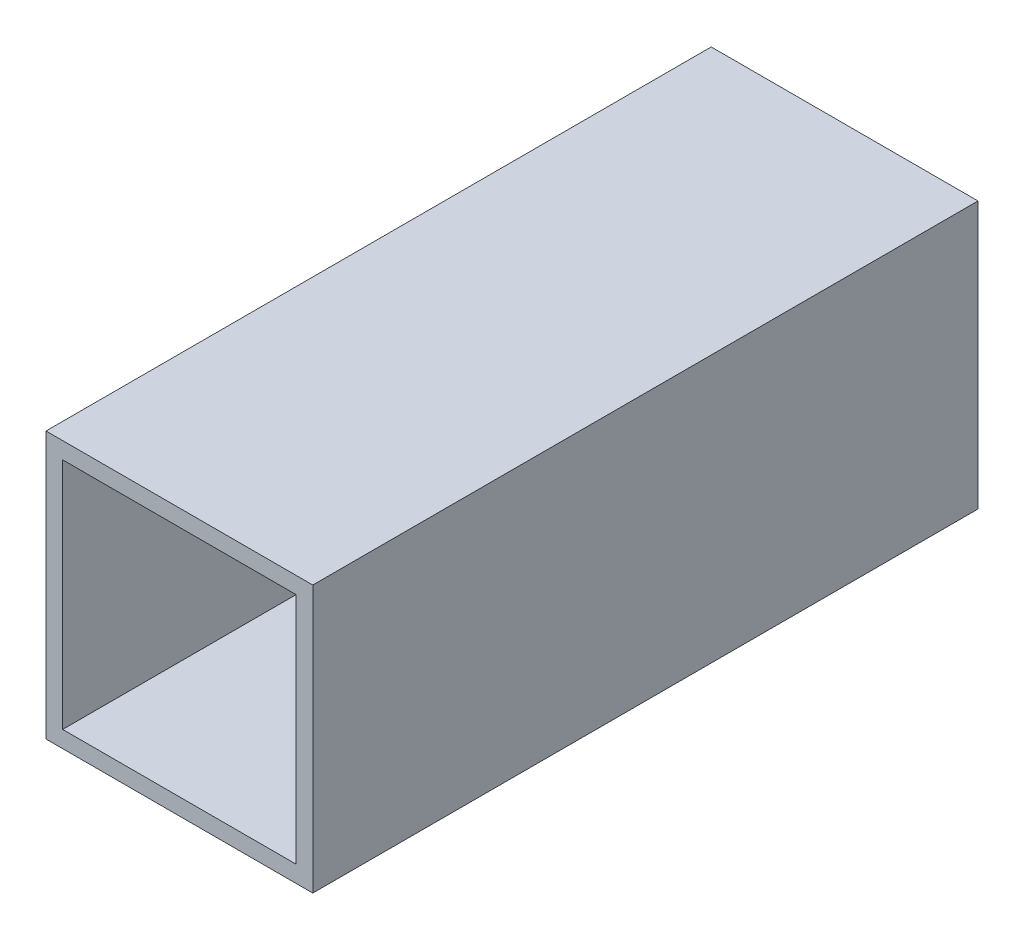
ISO-10303-21;
HEADER;
FILE_DESCRIPTION(('STEP AP214'),'2;1');
FILE_NAME('part.step','',(''),(''),'','','');
FILE_SCHEMA(('AUTOMOTIVE_DESIGN { 1 0 10303 214 1 1 1 1 }'));
ENDSEC;
DATA;
#1=APPLICATION_CONTEXT('core data for automotive mechanical design processes');
#2=APPLICATION_PROTOCOL_DEFINITION('international standard','automotive_design',2000,#1);
#3=PRODUCT_CONTEXT('',#1,'mechanical');
#4=PRODUCT('Part','Part','',(#3));
#5=PRODUCT_RELATED_PRODUCT_CATEGORY('part','',(#4));
#6=PRODUCT_DEFINITION_FORMATION('','',#4);
#7=PRODUCT_DEFINITION_CONTEXT('part definition',#1,'design');
#8=PRODUCT_DEFINITION('design','',#6,#7);
#9=PRODUCT_DEFINITION_SHAPE('','',#8);
#10=(LENGTH_UNIT() NAMED_UNIT(*) SI_UNIT(.MILLI.,.METRE.));
#11=(NAMED_UNIT(*) PLANE_ANGLE_UNIT() SI_UNIT($,.RADIAN.));
#12=(NAMED_UNIT(*) SI_UNIT($,.STERADIAN.) SOLID_ANGLE_UNIT());
#13=UNCERTAINTY_MEASURE_WITH_UNIT(LENGTH_MEASURE(1.E-05),#10,'distance_accuracy_value','');
#14=(GEOMETRIC_REPRESENTATION_CONTEXT(3) GLOBAL_UNCERTAINTY_ASSIGNED_CONTEXT((#13)) GLOBAL_UNIT_ASSIGNED_CONTEXT((#10,
#11,#12)) REPRESENTATION_CONTEXT('',''));
#15=CARTESIAN_POINT('',(0.,0.,0.));
#16=DIRECTION('',(0.,0.,1.));
#17=DIRECTION('',(1.,0.,0.));
#18=AXIS2_PLACEMENT_3D('',#15,#16,#17);
#19=CARTESIAN_POINT('',(0.,0.,-190.));
#20=DIRECTION('',(-1.,0.,0.));
#21=DIRECTION('',(0.,-1.,0.));
#22=AXIS2_PLACEMENT_3D('',#19,#20,#21);
#23=PLANE('',#22);
#24=DIRECTION('',(0.,-1.,0.));
#25=VECTOR('',#24,1.);
#26=CARTESIAN_POINT('',(0.,0.,0.));
#27=LINE('',#26,#25);
#28=CARTESIAN_POINT('',(0.,0.,0.));
#29=VERTEX_POINT('',#28);
#30=CARTESIAN_POINT('',(0.,-76.2,0.));
#31=VERTEX_POINT('',#30);
#32=EDGE_CURVE('E133',#29,#31,#27,.T.);
#33=ORIENTED_EDGE('',*,*,#32,.F.);
#34=DIRECTION('',(0.,0.,1.));
#35=VECTOR('',#34,1.);
#36=CARTESIAN_POINT('',(0.,0.,-190.));
#37=LINE('',#36,#35);
#38=CARTESIAN_POINT('',(0.,0.,-190.));
#39=VERTEX_POINT('',#38);
#40=EDGE_CURVE('E11',#39,#29,#37,.T.);
#41=ORIENTED_EDGE('',*,*,#40,.F.);
#42=DIRECTION('',(0.,-1.,0.));
#43=VECTOR('',#42,1.);
#44=CARTESIAN_POINT('',(0.,0.,-190.));
#45=LINE('',#44,#43);
#46=CARTESIAN_POINT('',(0.,-76.2,-190.));
#47=VERTEX_POINT('',#46);
#48=EDGE_CURVE('E137',#39,#47,#45,.T.);
#49=ORIENTED_EDGE('',*,*,#48,.T.);
#50=DIRECTION('',(0.,0.,1.));
#51=VECTOR('',#50,1.);
#52=CARTESIAN_POINT('',(0.,-76.2,-190.));
#53=LINE('',#52,#51);
#54=EDGE_CURVE('E38',#47,#31,#53,.T.);
#55=ORIENTED_EDGE('',*,*,#54,.T.);
#56=EDGE_LOOP('',(#33,#41,#49,#55));
#57=FACE_BOUND('',#56,.T.);
#58=ADVANCED_FACE('F35',(#57),#23,.T.);
#59=CARTESIAN_POINT('',(0.,0.,-190.));
#60=DIRECTION('',(0.,1.,0.));
#61=DIRECTION('',(0.,0.,1.));
#62=AXIS2_PLACEMENT_3D('',#59,#60,#61);
#63=PLANE('',#62);
#64=DIRECTION('',(-1.,0.,0.));
#65=VECTOR('',#64,1.);
#66=CARTESIAN_POINT('',(0.,0.,0.));
#67=LINE('',#66,#65);
#68=CARTESIAN_POINT('',(76.2,0.,0.));
#69=VERTEX_POINT('',#68);
#70=EDGE_CURVE('E141',#69,#29,#67,.T.);
#71=ORIENTED_EDGE('',*,*,#70,.F.);
#72=DIRECTION('',(0.,0.,1.));
#73=VECTOR('',#72,1.);
#74=CARTESIAN_POINT('',(76.2,0.,-190.));
#75=LINE('',#74,#73);
#76=CARTESIAN_POINT('',(76.2,0.,-190.));
#77=VERTEX_POINT('',#76);
#78=EDGE_CURVE('E43',#77,#69,#75,.T.);
#79=ORIENTED_EDGE('',*,*,#78,.F.);
#80=DIRECTION('',(-1.,0.,0.));
#81=VECTOR('',#80,1.);
#82=CARTESIAN_POINT('',(0.,0.,-190.));
#83=LINE('',#82,#81);
#84=EDGE_CURVE('E147',#77,#39,#83,.T.);
#85=ORIENTED_EDGE('',*,*,#84,.T.);
#86=ORIENTED_EDGE('',*,*,#40,.T.);
#87=EDGE_LOOP('',(#71,#79,#85,#86));
#88=FACE_BOUND('',#87,.T.);
#89=ADVANCED_FACE('F173',(#88),#63,.T.);
#90=CARTESIAN_POINT('',(76.2,0.,-190.));
#91=DIRECTION('',(1.,0.,0.));
#92=DIRECTION('',(0.,1.,0.));
#93=AXIS2_PLACEMENT_3D('',#90,#91,#92);
#94=PLANE('',#93);
#95=DIRECTION('',(0.,1.,0.));
#96=VECTOR('',#95,1.);
#97=CARTESIAN_POINT('',(76.2,0.,0.));
#98=LINE('',#97,#96);
#99=CARTESIAN_POINT('',(76.2,-76.2,0.));
#100=VERTEX_POINT('',#99);
#101=EDGE_CURVE('E155',#100,#69,#98,.T.);
#102=ORIENTED_EDGE('',*,*,#101,.F.);
#103=DIRECTION('',(0.,0.,1.));
#104=VECTOR('',#103,1.);
#105=CARTESIAN_POINT('',(76.2,-76.2,-190.));
#106=LINE('',#105,#104);
#107=CARTESIAN_POINT('',(76.2,-76.2,-190.));
#108=VERTEX_POINT('',#107);
#109=EDGE_CURVE('E160',#108,#100,#106,.T.);
#110=ORIENTED_EDGE('',*,*,#109,.F.);
#111=DIRECTION('',(0.,1.,0.));
#112=VECTOR('',#111,1.);
#113=CARTESIAN_POINT('',(76.2,0.,-190.));
#114=LINE('',#113,#112);
#115=EDGE_CURVE('E144',#108,#77,#114,.T.);
#116=ORIENTED_EDGE('',*,*,#115,.T.);
#117=ORIENTED_EDGE('',*,*,#78,.T.);
#118=EDGE_LOOP('',(#102,#110,#116,#117));
#119=FACE_BOUND('',#118,.T.);
#120=ADVANCED_FACE('F177',(#119),#94,.T.);
#121=CARTESIAN_POINT('',(0.,-76.2,-190.));
#122=DIRECTION('',(0.,-1.,0.));
#123=DIRECTION('',(0.,0.,-1.));
#124=AXIS2_PLACEMENT_3D('',#121,#122,#123);
#125=PLANE('',#124);
#126=DIRECTION('',(1.,0.,0.));
#127=VECTOR('',#126,1.);
#128=CARTESIAN_POINT('',(0.,-76.2,0.));
#129=LINE('',#128,#127);
#130=EDGE_CURVE('E152',#31,#100,#129,.T.);
#131=ORIENTED_EDGE('',*,*,#130,.F.);
#132=ORIENTED_EDGE('',*,*,#54,.F.);
#133=DIRECTION('',(1.,0.,0.));
#134=VECTOR('',#133,1.);
#135=CARTESIAN_POINT('',(0.,-76.2,-190.));
#136=LINE('',#135,#134);
#137=EDGE_CURVE('E140',#47,#108,#136,.T.);
#138=ORIENTED_EDGE('',*,*,#137,.T.);
#139=ORIENTED_EDGE('',*,*,#109,.T.);
#140=EDGE_LOOP('',(#131,#132,#138,#139));
#141=FACE_BOUND('',#140,.T.);
#142=ADVANCED_FACE('F168',(#141),#125,.T.);
#143=CARTESIAN_POINT('',(0.,0.,-190.));
#144=DIRECTION('',(0.,0.,1.));
#145=DIRECTION('',(1.,0.,0.));
#146=AXIS2_PLACEMENT_3D('',#143,#144,#145);
#147=PLANE('',#146);
#148=DIRECTION('',(-1.,0.,0.));
#149=VECTOR('',#148,1.);
#150=CARTESIAN_POINT('',(4.7625,-4.7625,-190.));
#151=LINE('',#150,#149);
#152=CARTESIAN_POINT('',(71.4375,-4.7625,-190.));
#153=VERTEX_POINT('',#152);
#154=CARTESIAN_POINT('',(4.7625,-4.7625,-190.));
#155=VERTEX_POINT('',#154);
#156=EDGE_CURVE('E108',#153,#155,#151,.T.);
#157=ORIENTED_EDGE('',*,*,#156,.T.);
#158=DIRECTION('',(0.,-1.,0.));
#159=VECTOR('',#158,1.);
#160=CARTESIAN_POINT('',(4.7625,-4.7625,-190.));
#161=LINE('',#160,#159);
#162=CARTESIAN_POINT('',(4.7625,-71.4375,-190.));
#163=VERTEX_POINT('',#162);
#164=EDGE_CURVE('E102',#155,#163,#161,.T.);
#165=ORIENTED_EDGE('',*,*,#164,.T.);
#166=DIRECTION('',(1.,0.,0.));
#167=VECTOR('',#166,1.);
#168=CARTESIAN_POINT('',(4.7625,-71.4375,-190.));
#169=LINE('',#168,#167);
#170=CARTESIAN_POINT('',(71.4375,-71.4375,-190.));
#171=VERTEX_POINT('',#170);
#172=EDGE_CURVE('E111',#163,#171,#169,.T.);
#173=ORIENTED_EDGE('',*,*,#172,.T.);
#174=DIRECTION('',(0.,1.,0.));
#175=VECTOR('',#174,1.);
#176=CARTESIAN_POINT('',(71.4375,-4.7625,-190.));
#177=LINE('',#176,#175);
#178=EDGE_CURVE('E51',#171,#153,#177,.T.);
#179=ORIENTED_EDGE('',*,*,#178,.T.);
#180=EDGE_LOOP('',(#157,#165,#173,#179));
#181=FACE_BOUND('',#180,.T.);
#182=ORIENTED_EDGE('',*,*,#48,.F.);
#183=ORIENTED_EDGE('',*,*,#84,.F.);
#184=ORIENTED_EDGE('',*,*,#115,.F.);
#185=ORIENTED_EDGE('',*,*,#137,.F.);
#186=EDGE_LOOP('',(#182,#183,#184,#185));
#187=FACE_BOUND('',#186,.T.);
#188=ADVANCED_FACE('F115',(#181,#187),#147,.F.);
#189=CARTESIAN_POINT('',(0.,0.,0.));
#190=DIRECTION('',(0.,0.,1.));
#191=DIRECTION('',(1.,0.,0.));
#192=AXIS2_PLACEMENT_3D('',#189,#190,#191);
#193=PLANE('',#192);
#194=DIRECTION('',(0.,-1.,0.));
#195=VECTOR('',#194,1.);
#196=CARTESIAN_POINT('',(4.7625,-4.7625,0.));
#197=LINE('',#196,#195);
#198=CARTESIAN_POINT('',(4.7625,-4.7625,0.));
#199=VERTEX_POINT('',#198);
#200=CARTESIAN_POINT('',(4.7625,-71.4375,0.));
#201=VERTEX_POINT('',#200);
#202=EDGE_CURVE('E59',#199,#201,#197,.T.);
#203=ORIENTED_EDGE('',*,*,#202,.F.);
#204=DIRECTION('',(-1.,0.,0.));
#205=VECTOR('',#204,1.);
#206=CARTESIAN_POINT('',(4.7625,-4.7625,0.));
#207=LINE('',#206,#205);
#208=CARTESIAN_POINT('',(71.4375,-4.7625,0.));
#209=VERTEX_POINT('',#208);
#210=EDGE_CURVE('E118',#209,#199,#207,.T.);
#211=ORIENTED_EDGE('',*,*,#210,.F.);
#212=DIRECTION('',(0.,1.,0.));
#213=VECTOR('',#212,1.);
#214=CARTESIAN_POINT('',(71.4375,-4.7625,0.));
#215=LINE('',#214,#213);
#216=CARTESIAN_POINT('',(71.4375,-71.4375,0.));
#217=VERTEX_POINT('',#216);
#218=EDGE_CURVE('E121',#217,#209,#215,.T.);
#219=ORIENTED_EDGE('',*,*,#218,.F.);
#220=DIRECTION('',(1.,0.,0.));
#221=VECTOR('',#220,1.);
#222=CARTESIAN_POINT('',(4.7625,-71.4375,0.));
#223=LINE('',#222,#221);
#224=EDGE_CURVE('E127',#201,#217,#223,.T.);
#225=ORIENTED_EDGE('',*,*,#224,.F.);
#226=EDGE_LOOP('',(#203,#211,#219,#225));
#227=FACE_BOUND('',#226,.T.);
#228=ORIENTED_EDGE('',*,*,#32,.T.);
#229=ORIENTED_EDGE('',*,*,#130,.T.);
#230=ORIENTED_EDGE('',*,*,#101,.T.);
#231=ORIENTED_EDGE('',*,*,#70,.T.);
#232=EDGE_LOOP('',(#228,#229,#230,#231));
#233=FACE_BOUND('',#232,.T.);
#234=ADVANCED_FACE('F170',(#227,#233),#193,.T.);
#235=CARTESIAN_POINT('',(4.7625,-4.7625,-190.));
#236=DIRECTION('',(-1.,0.,0.));
#237=DIRECTION('',(0.,0.,1.));
#238=AXIS2_PLACEMENT_3D('',#235,#236,#237);
#239=PLANE('',#238);
#240=ORIENTED_EDGE('',*,*,#202,.T.);
#241=DIRECTION('',(0.,0.,1.));
#242=VECTOR('',#241,1.);
#243=CARTESIAN_POINT('',(4.7625,-71.4375,-190.));
#244=LINE('',#243,#242);
#245=EDGE_CURVE('E98',#163,#201,#244,.T.);
#246=ORIENTED_EDGE('',*,*,#245,.F.);
#247=ORIENTED_EDGE('',*,*,#164,.F.);
#248=DIRECTION('',(0.,0.,1.));
#249=VECTOR('',#248,1.);
#250=CARTESIAN_POINT('',(4.7625,-4.7625,-190.));
#251=LINE('',#250,#249);
#252=EDGE_CURVE('E131',#155,#199,#251,.T.);
#253=ORIENTED_EDGE('',*,*,#252,.T.);
#254=EDGE_LOOP('',(#240,#246,#247,#253));
#255=FACE_BOUND('',#254,.T.);
#256=ADVANCED_FACE('F100',(#255),#239,.F.);
#257=CARTESIAN_POINT('',(4.7625,-4.7625,-190.));
#258=DIRECTION('',(0.,1.,0.));
#259=DIRECTION('',(0.,0.,1.));
#260=AXIS2_PLACEMENT_3D('',#257,#258,#259);
#261=PLANE('',#260);
#262=ORIENTED_EDGE('',*,*,#210,.T.);
#263=ORIENTED_EDGE('',*,*,#252,.F.);
#264=ORIENTED_EDGE('',*,*,#156,.F.);
#265=DIRECTION('',(0.,0.,1.));
#266=VECTOR('',#265,1.);
#267=CARTESIAN_POINT('',(71.4375,-4.7625,-190.));
#268=LINE('',#267,#266);
#269=EDGE_CURVE('E134',#153,#209,#268,.T.);
#270=ORIENTED_EDGE('',*,*,#269,.T.);
#271=EDGE_LOOP('',(#262,#263,#264,#270));
#272=FACE_BOUND('',#271,.T.);
#273=ADVANCED_FACE('F228',(#272),#261,.F.);
#274=CARTESIAN_POINT('',(71.4375,-4.7625,-190.));
#275=DIRECTION('',(1.,0.,0.));
#276=DIRECTION('',(0.,0.,-1.));
#277=AXIS2_PLACEMENT_3D('',#274,#275,#276);
#278=PLANE('',#277);
#279=ORIENTED_EDGE('',*,*,#218,.T.);
#280=ORIENTED_EDGE('',*,*,#269,.F.);
#281=ORIENTED_EDGE('',*,*,#178,.F.);
#282=DIRECTION('',(0.,0.,1.));
#283=VECTOR('',#282,1.);
#284=CARTESIAN_POINT('',(71.4375,-71.4375,-190.));
#285=LINE('',#284,#283);
#286=EDGE_CURVE('E107',#171,#217,#285,.T.);
#287=ORIENTED_EDGE('',*,*,#286,.T.);
#288=EDGE_LOOP('',(#279,#280,#281,#287));
#289=FACE_BOUND('',#288,.T.);
#290=ADVANCED_FACE('F237',(#289),#278,.F.);
#291=CARTESIAN_POINT('',(4.7625,-71.4375,-190.));
#292=DIRECTION('',(0.,-1.,0.));
#293=DIRECTION('',(0.,0.,-1.));
#294=AXIS2_PLACEMENT_3D('',#291,#292,#293);
#295=PLANE('',#294);
#296=ORIENTED_EDGE('',*,*,#224,.T.);
#297=ORIENTED_EDGE('',*,*,#286,.F.);
#298=ORIENTED_EDGE('',*,*,#172,.F.);
#299=ORIENTED_EDGE('',*,*,#245,.T.);
#300=EDGE_LOOP('',(#296,#297,#298,#299));
#301=FACE_BOUND('',#300,.T.);
#302=ADVANCED_FACE('F112',(#301),#295,.F.);
#303=CLOSED_SHELL('',(#58,#89,#120,#142,#188,#234,#256,#273,#290,#302));
#304=MANIFOLD_SOLID_BREP('B2',#303);
#305=ADVANCED_BREP_SHAPE_REPRESENTATION('',(#18,#304),#14);
#306=SHAPE_DEFINITION_REPRESENTATION(#9,#305);
ENDSEC;
END-ISO-10303-21;
